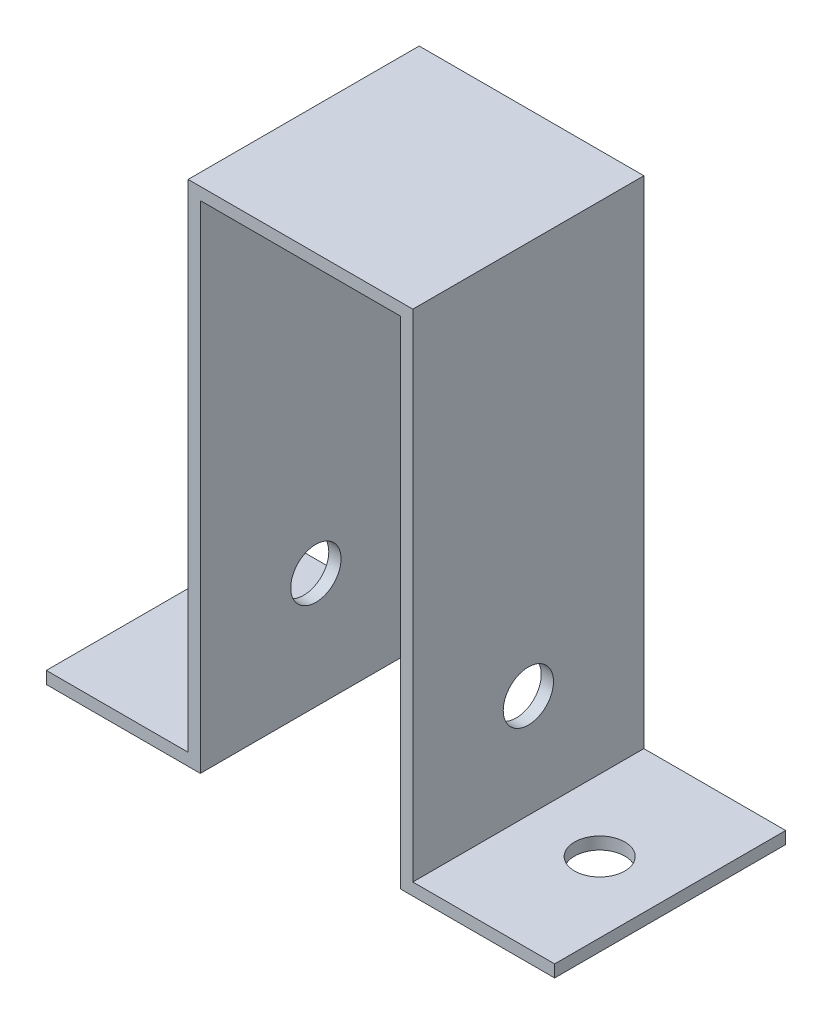
ISO-10303-21;
HEADER;
FILE_DESCRIPTION(('STEP AP214'),'2;1');
FILE_NAME('part.step','',(''),(''),'','','');
FILE_SCHEMA(('AUTOMOTIVE_DESIGN { 1 0 10303 214 1 1 1 1 }'));
ENDSEC;
DATA;
#1=APPLICATION_CONTEXT('core data for automotive mechanical design processes');
#2=APPLICATION_PROTOCOL_DEFINITION('international standard','automotive_design',2000,#1);
#3=PRODUCT_CONTEXT('',#1,'mechanical');
#4=PRODUCT('Part','Part','',(#3));
#5=PRODUCT_RELATED_PRODUCT_CATEGORY('part','',(#4));
#6=PRODUCT_DEFINITION_FORMATION('','',#4);
#7=PRODUCT_DEFINITION_CONTEXT('part definition',#1,'design');
#8=PRODUCT_DEFINITION('design','',#6,#7);
#9=PRODUCT_DEFINITION_SHAPE('','',#8);
#10=(LENGTH_UNIT() NAMED_UNIT(*) SI_UNIT(.MILLI.,.METRE.));
#11=(NAMED_UNIT(*) PLANE_ANGLE_UNIT() SI_UNIT($,.RADIAN.));
#12=(NAMED_UNIT(*) SI_UNIT($,.STERADIAN.) SOLID_ANGLE_UNIT());
#13=UNCERTAINTY_MEASURE_WITH_UNIT(LENGTH_MEASURE(1.E-05),#10,'distance_accuracy_value','');
#14=(GEOMETRIC_REPRESENTATION_CONTEXT(3) GLOBAL_UNCERTAINTY_ASSIGNED_CONTEXT((#13)) GLOBAL_UNIT_ASSIGNED_CONTEXT((#10,
#11,#12)) REPRESENTATION_CONTEXT('',''));
#15=CARTESIAN_POINT('',(0.,0.,0.));
#16=DIRECTION('',(0.,0.,1.));
#17=DIRECTION('',(1.,0.,0.));
#18=AXIS2_PLACEMENT_3D('',#15,#16,#17);
#19=CARTESIAN_POINT('',(0.,33.,7.5));
#20=DIRECTION('',(0.,-1.,0.));
#21=DIRECTION('',(1.,0.,0.));
#22=AXIS2_PLACEMENT_3D('',#19,#20,#21);
#23=PLANE('',#22);
#24=DIRECTION('',(-1.,0.,0.));
#25=VECTOR('',#24,1.);
#26=CARTESIAN_POINT('',(0.,33.,-7.5));
#27=LINE('',#26,#25);
#28=CARTESIAN_POINT('',(7.29375,33.,-7.5));
#29=VERTEX_POINT('',#28);
#30=CARTESIAN_POINT('',(-7.29375,33.,-7.5));
#31=VERTEX_POINT('',#30);
#32=EDGE_CURVE('E126',#29,#31,#27,.T.);
#33=ORIENTED_EDGE('',*,*,#32,.T.);
#34=DIRECTION('',(0.,0.,-1.));
#35=VECTOR('',#34,1.);
#36=CARTESIAN_POINT('',(-7.29375,33.,7.5));
#37=LINE('',#36,#35);
#38=CARTESIAN_POINT('',(-7.29375,33.,7.5));
#39=VERTEX_POINT('',#38);
#40=EDGE_CURVE('E11',#39,#31,#37,.T.);
#41=ORIENTED_EDGE('',*,*,#40,.F.);
#42=DIRECTION('',(-1.,0.,0.));
#43=VECTOR('',#42,1.);
#44=CARTESIAN_POINT('',(0.,33.,7.5));
#45=LINE('',#44,#43);
#46=CARTESIAN_POINT('',(7.29375,33.,7.5));
#47=VERTEX_POINT('',#46);
#48=EDGE_CURVE('E89',#47,#39,#45,.T.);
#49=ORIENTED_EDGE('',*,*,#48,.F.);
#50=DIRECTION('',(0.,0.,-1.));
#51=VECTOR('',#50,1.);
#52=CARTESIAN_POINT('',(7.29375,33.,7.5));
#53=LINE('',#52,#51);
#54=EDGE_CURVE('E191',#47,#29,#53,.T.);
#55=ORIENTED_EDGE('',*,*,#54,.T.);
#56=EDGE_LOOP('',(#33,#41,#49,#55));
#57=FACE_BOUND('',#56,.T.);
#58=ADVANCED_FACE('F35',(#57),#23,.F.);
#59=CARTESIAN_POINT('',(-7.29375,33.,7.5));
#60=DIRECTION('',(1.,0.,0.));
#61=DIRECTION('',(0.,1.,0.));
#62=AXIS2_PLACEMENT_3D('',#59,#60,#61);
#63=PLANE('',#62);
#64=CARTESIAN_POINT('',(-7.29375,7.5,0.));
#65=DIRECTION('',(1.,0.,0.));
#66=DIRECTION('',(0.,1.,0.));
#67=AXIS2_PLACEMENT_3D('',#64,#65,#66);
#68=CIRCLE('',#67,1.63195);
#69=CARTESIAN_POINT('',(-7.29375,9.13195,0.));
#70=VERTEX_POINT('',#69);
#71=EDGE_CURVE('E129',#70,#70,#68,.T.);
#72=ORIENTED_EDGE('',*,*,#71,.T.);
#73=EDGE_LOOP('',(#72));
#74=FACE_BOUND('',#73,.T.);
#75=DIRECTION('',(0.,-1.,0.));
#76=VECTOR('',#75,1.);
#77=CARTESIAN_POINT('',(-7.29375,33.,-7.5));
#78=LINE('',#77,#76);
#79=CARTESIAN_POINT('',(-7.29375,0.79375,-7.5));
#80=VERTEX_POINT('',#79);
#81=EDGE_CURVE('E128',#31,#80,#78,.T.);
#82=ORIENTED_EDGE('',*,*,#81,.T.);
#83=DIRECTION('',(0.,0.,-1.));
#84=VECTOR('',#83,1.);
#85=CARTESIAN_POINT('',(-7.29375,0.79375,7.5));
#86=LINE('',#85,#84);
#87=CARTESIAN_POINT('',(-7.29375,0.79375,7.5));
#88=VERTEX_POINT('',#87);
#89=EDGE_CURVE('E43',#88,#80,#86,.T.);
#90=ORIENTED_EDGE('',*,*,#89,.F.);
#91=DIRECTION('',(0.,-1.,0.));
#92=VECTOR('',#91,1.);
#93=CARTESIAN_POINT('',(-7.29375,33.,7.5));
#94=LINE('',#93,#92);
#95=EDGE_CURVE('E186',#39,#88,#94,.T.);
#96=ORIENTED_EDGE('',*,*,#95,.F.);
#97=ORIENTED_EDGE('',*,*,#40,.T.);
#98=EDGE_LOOP('',(#82,#90,#96,#97));
#99=FACE_BOUND('',#98,.T.);
#100=ADVANCED_FACE('F187',(#74,#99),#63,.F.);
#101=CARTESIAN_POINT('',(-7.29375,0.79375,7.5));
#102=DIRECTION('',(0.,-1.,0.));
#103=DIRECTION('',(1.,0.,0.));
#104=AXIS2_PLACEMENT_3D('',#101,#102,#103);
#105=PLANE('',#104);
#106=CARTESIAN_POINT('',(-11.925,0.793749999999999,0.));
#107=DIRECTION('',(0.,-1.,0.));
#108=DIRECTION('',(1.,0.,0.));
#109=AXIS2_PLACEMENT_3D('',#106,#107,#108);
#110=CIRCLE('',#109,1.63194999999999);
#111=CARTESIAN_POINT('',(-10.29305,0.793749999999999,0.));
#112=VERTEX_POINT('',#111);
#113=EDGE_CURVE('E355',#112,#112,#110,.T.);
#114=ORIENTED_EDGE('',*,*,#113,.T.);
#115=EDGE_LOOP('',(#114));
#116=FACE_BOUND('',#115,.T.);
#117=DIRECTION('',(-1.,0.,0.));
#118=VECTOR('',#117,1.);
#119=CARTESIAN_POINT('',(-7.29375,0.79375,-7.5));
#120=LINE('',#119,#118);
#121=CARTESIAN_POINT('',(-16.5,0.793749999999999,-7.5));
#122=VERTEX_POINT('',#121);
#123=EDGE_CURVE('E131',#80,#122,#120,.T.);
#124=ORIENTED_EDGE('',*,*,#123,.T.);
#125=DIRECTION('',(0.,0.,-1.));
#126=VECTOR('',#125,1.);
#127=CARTESIAN_POINT('',(-16.5,0.793749999999999,7.5));
#128=LINE('',#127,#126);
#129=CARTESIAN_POINT('',(-16.5,0.793749999999999,7.5));
#130=VERTEX_POINT('',#129);
#131=EDGE_CURVE('E115',#130,#122,#128,.T.);
#132=ORIENTED_EDGE('',*,*,#131,.F.);
#133=DIRECTION('',(-1.,0.,0.));
#134=VECTOR('',#133,1.);
#135=CARTESIAN_POINT('',(-7.29375,0.79375,7.5));
#136=LINE('',#135,#134);
#137=EDGE_CURVE('E106',#88,#130,#136,.T.);
#138=ORIENTED_EDGE('',*,*,#137,.F.);
#139=ORIENTED_EDGE('',*,*,#89,.T.);
#140=EDGE_LOOP('',(#124,#132,#138,#139));
#141=FACE_BOUND('',#140,.T.);
#142=ADVANCED_FACE('F145',(#116,#141),#105,.F.);
#143=CARTESIAN_POINT('',(-16.5,0.793749999999999,7.5));
#144=DIRECTION('',(1.,0.,0.));
#145=DIRECTION('',(0.,0.,-1.));
#146=AXIS2_PLACEMENT_3D('',#143,#144,#145);
#147=PLANE('',#146);
#148=DIRECTION('',(0.,-1.,0.));
#149=VECTOR('',#148,1.);
#150=CARTESIAN_POINT('',(-16.5,0.793749999999999,-7.5));
#151=LINE('',#150,#149);
#152=CARTESIAN_POINT('',(-16.5,0.,-7.5));
#153=VERTEX_POINT('',#152);
#154=EDGE_CURVE('E114',#122,#153,#151,.T.);
#155=ORIENTED_EDGE('',*,*,#154,.T.);
#156=DIRECTION('',(0.,0.,-1.));
#157=VECTOR('',#156,1.);
#158=CARTESIAN_POINT('',(-16.5,0.,7.5));
#159=LINE('',#158,#157);
#160=CARTESIAN_POINT('',(-16.5,0.,7.5));
#161=VERTEX_POINT('',#160);
#162=EDGE_CURVE('E111',#161,#153,#159,.T.);
#163=ORIENTED_EDGE('',*,*,#162,.F.);
#164=DIRECTION('',(0.,-1.,0.));
#165=VECTOR('',#164,1.);
#166=CARTESIAN_POINT('',(-16.5,0.793749999999999,7.5));
#167=LINE('',#166,#165);
#168=EDGE_CURVE('E100',#130,#161,#167,.T.);
#169=ORIENTED_EDGE('',*,*,#168,.F.);
#170=ORIENTED_EDGE('',*,*,#131,.T.);
#171=EDGE_LOOP('',(#155,#163,#169,#170));
#172=FACE_BOUND('',#171,.T.);
#173=ADVANCED_FACE('F112',(#172),#147,.F.);
#174=CARTESIAN_POINT('',(-6.5,0.,7.5));
#175=DIRECTION('',(0.,1.,0.));
#176=DIRECTION('',(-1.,0.,0.));
#177=AXIS2_PLACEMENT_3D('',#174,#175,#176);
#178=PLANE('',#177);
#179=CARTESIAN_POINT('',(-11.925,0.,0.));
#180=DIRECTION('',(0.,-1.,0.));
#181=DIRECTION('',(0.,0.,-1.));
#182=AXIS2_PLACEMENT_3D('',#179,#180,#181);
#183=CIRCLE('',#182,1.63194999999999);
#184=CARTESIAN_POINT('',(-11.925,0.,-1.63194999999999));
#185=VERTEX_POINT('',#184);
#186=EDGE_CURVE('E352',#185,#185,#183,.T.);
#187=ORIENTED_EDGE('',*,*,#186,.F.);
#188=EDGE_LOOP('',(#187));
#189=FACE_BOUND('',#188,.T.);
#190=DIRECTION('',(1.,0.,0.));
#191=VECTOR('',#190,1.);
#192=CARTESIAN_POINT('',(-6.5,0.,-7.5));
#193=LINE('',#192,#191);
#194=CARTESIAN_POINT('',(-6.5,0.,-7.5));
#195=VERTEX_POINT('',#194);
#196=EDGE_CURVE('E75',#153,#195,#193,.T.);
#197=ORIENTED_EDGE('',*,*,#196,.T.);
#198=DIRECTION('',(0.,0.,-1.));
#199=VECTOR('',#198,1.);
#200=CARTESIAN_POINT('',(-6.5,0.,7.5));
#201=LINE('',#200,#199);
#202=CARTESIAN_POINT('',(-6.5,0.,7.5));
#203=VERTEX_POINT('',#202);
#204=EDGE_CURVE('E116',#203,#195,#201,.T.);
#205=ORIENTED_EDGE('',*,*,#204,.F.);
#206=DIRECTION('',(1.,0.,0.));
#207=VECTOR('',#206,1.);
#208=CARTESIAN_POINT('',(-6.5,0.,7.5));
#209=LINE('',#208,#207);
#210=EDGE_CURVE('E104',#161,#203,#209,.T.);
#211=ORIENTED_EDGE('',*,*,#210,.F.);
#212=ORIENTED_EDGE('',*,*,#162,.T.);
#213=EDGE_LOOP('',(#197,#205,#211,#212));
#214=FACE_BOUND('',#213,.T.);
#215=ADVANCED_FACE('F118',(#189,#214),#178,.F.);
#216=CARTESIAN_POINT('',(-6.5,32.20625,7.5));
#217=DIRECTION('',(-1.,0.,0.));
#218=DIRECTION('',(0.,-1.,0.));
#219=AXIS2_PLACEMENT_3D('',#216,#217,#218);
#220=PLANE('',#219);
#221=CARTESIAN_POINT('',(-6.5,7.5,0.));
#222=DIRECTION('',(1.,0.,0.));
#223=DIRECTION('',(0.,0.,-1.));
#224=AXIS2_PLACEMENT_3D('',#221,#222,#223);
#225=CIRCLE('',#224,1.63195);
#226=CARTESIAN_POINT('',(-6.5,7.5,-1.63195));
#227=VERTEX_POINT('',#226);
#228=EDGE_CURVE('E173',#227,#227,#225,.T.);
#229=ORIENTED_EDGE('',*,*,#228,.F.);
#230=EDGE_LOOP('',(#229));
#231=FACE_BOUND('',#230,.T.);
#232=DIRECTION('',(0.,1.,0.));
#233=VECTOR('',#232,1.);
#234=CARTESIAN_POINT('',(-6.5,32.20625,-7.5));
#235=LINE('',#234,#233);
#236=CARTESIAN_POINT('',(-6.5,32.20625,-7.5));
#237=VERTEX_POINT('',#236);
#238=EDGE_CURVE('E81',#195,#237,#235,.T.);
#239=ORIENTED_EDGE('',*,*,#238,.T.);
#240=DIRECTION('',(0.,0.,-1.));
#241=VECTOR('',#240,1.);
#242=CARTESIAN_POINT('',(-6.5,32.20625,7.5));
#243=LINE('',#242,#241);
#244=CARTESIAN_POINT('',(-6.5,32.20625,7.5));
#245=VERTEX_POINT('',#244);
#246=EDGE_CURVE('E125',#245,#237,#243,.T.);
#247=ORIENTED_EDGE('',*,*,#246,.F.);
#248=DIRECTION('',(0.,1.,0.));
#249=VECTOR('',#248,1.);
#250=CARTESIAN_POINT('',(-6.5,32.20625,7.5));
#251=LINE('',#250,#249);
#252=EDGE_CURVE('E51',#203,#245,#251,.T.);
#253=ORIENTED_EDGE('',*,*,#252,.F.);
#254=ORIENTED_EDGE('',*,*,#204,.T.);
#255=EDGE_LOOP('',(#239,#247,#253,#254));
#256=FACE_BOUND('',#255,.T.);
#257=ADVANCED_FACE('F290',(#231,#256),#220,.F.);
#258=CARTESIAN_POINT('',(0.,32.20625,7.5));
#259=DIRECTION('',(0.,1.,0.));
#260=DIRECTION('',(0.,0.,1.));
#261=AXIS2_PLACEMENT_3D('',#258,#259,#260);
#262=PLANE('',#261);
#263=DIRECTION('',(1.,0.,0.));
#264=VECTOR('',#263,1.);
#265=CARTESIAN_POINT('',(0.,32.20625,-7.5));
#266=LINE('',#265,#264);
#267=CARTESIAN_POINT('',(6.5,32.20625,-7.5));
#268=VERTEX_POINT('',#267);
#269=EDGE_CURVE('E136',#237,#268,#266,.T.);
#270=ORIENTED_EDGE('',*,*,#269,.T.);
#271=DIRECTION('',(0.,0.,-1.));
#272=VECTOR('',#271,1.);
#273=CARTESIAN_POINT('',(6.5,32.20625,7.5));
#274=LINE('',#273,#272);
#275=CARTESIAN_POINT('',(6.5,32.20625,7.5));
#276=VERTEX_POINT('',#275);
#277=EDGE_CURVE('E164',#276,#268,#274,.T.);
#278=ORIENTED_EDGE('',*,*,#277,.F.);
#279=DIRECTION('',(1.,0.,0.));
#280=VECTOR('',#279,1.);
#281=CARTESIAN_POINT('',(0.,32.20625,7.5));
#282=LINE('',#281,#280);
#283=EDGE_CURVE('E120',#245,#276,#282,.T.);
#284=ORIENTED_EDGE('',*,*,#283,.F.);
#285=ORIENTED_EDGE('',*,*,#246,.T.);
#286=EDGE_LOOP('',(#270,#278,#284,#285));
#287=FACE_BOUND('',#286,.T.);
#288=ADVANCED_FACE('F161',(#287),#262,.F.);
#289=CARTESIAN_POINT('',(0.,0.,7.5));
#290=DIRECTION('',(0.,0.,-1.));
#291=DIRECTION('',(-1.,0.,0.));
#292=AXIS2_PLACEMENT_3D('',#289,#290,#291);
#293=PLANE('',#292);
#294=ORIENTED_EDGE('',*,*,#283,.T.);
#295=DIRECTION('',(0.,1.,0.));
#296=VECTOR('',#295,1.);
#297=CARTESIAN_POINT('',(6.5,32.20625,7.5));
#298=LINE('',#297,#296);
#299=CARTESIAN_POINT('',(6.5,0.,7.5));
#300=VERTEX_POINT('',#299);
#301=EDGE_CURVE('E172',#300,#276,#298,.T.);
#302=ORIENTED_EDGE('',*,*,#301,.F.);
#303=DIRECTION('',(-1.,0.,0.));
#304=VECTOR('',#303,1.);
#305=CARTESIAN_POINT('',(6.5,0.,7.5));
#306=LINE('',#305,#304);
#307=CARTESIAN_POINT('',(16.5,0.,7.5));
#308=VERTEX_POINT('',#307);
#309=EDGE_CURVE('E227',#308,#300,#306,.T.);
#310=ORIENTED_EDGE('',*,*,#309,.F.);
#311=DIRECTION('',(0.,-1.,0.));
#312=VECTOR('',#311,1.);
#313=CARTESIAN_POINT('',(16.5,0.793749999999999,7.5));
#314=LINE('',#313,#312);
#315=CARTESIAN_POINT('',(16.5,0.793749999999999,7.5));
#316=VERTEX_POINT('',#315);
#317=EDGE_CURVE('E231',#316,#308,#314,.T.);
#318=ORIENTED_EDGE('',*,*,#317,.F.);
#319=DIRECTION('',(1.,0.,0.));
#320=VECTOR('',#319,1.);
#321=CARTESIAN_POINT('',(7.29375,0.79375,7.5));
#322=LINE('',#321,#320);
#323=CARTESIAN_POINT('',(7.29375,0.79375,7.5));
#324=VERTEX_POINT('',#323);
#325=EDGE_CURVE('E233',#324,#316,#322,.T.);
#326=ORIENTED_EDGE('',*,*,#325,.F.);
#327=DIRECTION('',(0.,-1.,0.));
#328=VECTOR('',#327,1.);
#329=CARTESIAN_POINT('',(7.29375,33.,7.5));
#330=LINE('',#329,#328);
#331=EDGE_CURVE('E239',#47,#324,#330,.T.);
#332=ORIENTED_EDGE('',*,*,#331,.F.);
#333=ORIENTED_EDGE('',*,*,#48,.T.);
#334=ORIENTED_EDGE('',*,*,#95,.T.);
#335=ORIENTED_EDGE('',*,*,#137,.T.);
#336=ORIENTED_EDGE('',*,*,#168,.T.);
#337=ORIENTED_EDGE('',*,*,#210,.T.);
#338=ORIENTED_EDGE('',*,*,#252,.T.);
#339=EDGE_LOOP('',(#294,#302,#310,#318,#326,#332,#333,#334,#335,#336,#337,#338));
#340=FACE_BOUND('',#339,.T.);
#341=ADVANCED_FACE('F102',(#340),#293,.F.);
#342=CARTESIAN_POINT('',(0.,0.,-7.5));
#343=DIRECTION('',(0.,0.,-1.));
#344=DIRECTION('',(-1.,0.,0.));
#345=AXIS2_PLACEMENT_3D('',#342,#343,#344);
#346=PLANE('',#345);
#347=ORIENTED_EDGE('',*,*,#32,.F.);
#348=DIRECTION('',(0.,-1.,0.));
#349=VECTOR('',#348,1.);
#350=CARTESIAN_POINT('',(7.29375,33.,-7.5));
#351=LINE('',#350,#349);
#352=CARTESIAN_POINT('',(7.29375,0.79375,-7.5));
#353=VERTEX_POINT('',#352);
#354=EDGE_CURVE('E196',#29,#353,#351,.T.);
#355=ORIENTED_EDGE('',*,*,#354,.T.);
#356=DIRECTION('',(1.,0.,0.));
#357=VECTOR('',#356,1.);
#358=CARTESIAN_POINT('',(7.29375,0.79375,-7.5));
#359=LINE('',#358,#357);
#360=CARTESIAN_POINT('',(16.5,0.793749999999999,-7.5));
#361=VERTEX_POINT('',#360);
#362=EDGE_CURVE('E248',#353,#361,#359,.T.);
#363=ORIENTED_EDGE('',*,*,#362,.T.);
#364=DIRECTION('',(0.,-1.,0.));
#365=VECTOR('',#364,1.);
#366=CARTESIAN_POINT('',(16.5,0.793749999999999,-7.5));
#367=LINE('',#366,#365);
#368=CARTESIAN_POINT('',(16.5,0.,-7.5));
#369=VERTEX_POINT('',#368);
#370=EDGE_CURVE('E245',#361,#369,#367,.T.);
#371=ORIENTED_EDGE('',*,*,#370,.T.);
#372=DIRECTION('',(-1.,0.,0.));
#373=VECTOR('',#372,1.);
#374=CARTESIAN_POINT('',(6.5,0.,-7.5));
#375=LINE('',#374,#373);
#376=CARTESIAN_POINT('',(6.5,0.,-7.5));
#377=VERTEX_POINT('',#376);
#378=EDGE_CURVE('E242',#369,#377,#375,.T.);
#379=ORIENTED_EDGE('',*,*,#378,.T.);
#380=DIRECTION('',(0.,1.,0.));
#381=VECTOR('',#380,1.);
#382=CARTESIAN_POINT('',(6.5,32.20625,-7.5));
#383=LINE('',#382,#381);
#384=EDGE_CURVE('E157',#377,#268,#383,.T.);
#385=ORIENTED_EDGE('',*,*,#384,.T.);
#386=ORIENTED_EDGE('',*,*,#269,.F.);
#387=ORIENTED_EDGE('',*,*,#238,.F.);
#388=ORIENTED_EDGE('',*,*,#196,.F.);
#389=ORIENTED_EDGE('',*,*,#154,.F.);
#390=ORIENTED_EDGE('',*,*,#123,.F.);
#391=ORIENTED_EDGE('',*,*,#81,.F.);
#392=EDGE_LOOP('',(#347,#355,#363,#371,#379,#385,#386,#387,#388,#389,#390,#391));
#393=FACE_BOUND('',#392,.T.);
#394=ADVANCED_FACE('F151',(#393),#346,.T.);
#395=CARTESIAN_POINT('',(-6.5,7.5,0.));
#396=DIRECTION('',(1.,0.,0.));
#397=DIRECTION('',(0.,0.,-1.));
#398=AXIS2_PLACEMENT_3D('',#395,#396,#397);
#399=CYLINDRICAL_SURFACE('',#398,1.63195);
#400=ORIENTED_EDGE('',*,*,#228,.T.);
#401=EDGE_LOOP('',(#400));
#402=FACE_BOUND('',#401,.T.);
#403=ORIENTED_EDGE('',*,*,#71,.F.);
#404=EDGE_LOOP('',(#403));
#405=FACE_BOUND('',#404,.T.);
#406=ADVANCED_FACE('F299',(#402,#405),#399,.F.);
#407=CARTESIAN_POINT('',(6.5,32.20625,7.5));
#408=DIRECTION('',(-1.,0.,0.));
#409=DIRECTION('',(0.,-1.,0.));
#410=AXIS2_PLACEMENT_3D('',#407,#408,#409);
#411=PLANE('',#410);
#412=CARTESIAN_POINT('',(6.5,7.5,0.));
#413=DIRECTION('',(-1.,0.,0.));
#414=DIRECTION('',(0.,0.,1.));
#415=AXIS2_PLACEMENT_3D('',#412,#413,#414);
#416=CIRCLE('',#415,1.63195);
#417=CARTESIAN_POINT('',(6.5,7.5,1.63195));
#418=VERTEX_POINT('',#417);
#419=EDGE_CURVE('E365',#418,#418,#416,.T.);
#420=ORIENTED_EDGE('',*,*,#419,.F.);
#421=EDGE_LOOP('',(#420));
#422=FACE_BOUND('',#421,.T.);
#423=ORIENTED_EDGE('',*,*,#384,.F.);
#424=DIRECTION('',(0.,0.,-1.));
#425=VECTOR('',#424,1.);
#426=CARTESIAN_POINT('',(6.5,0.,7.5));
#427=LINE('',#426,#425);
#428=EDGE_CURVE('E174',#300,#377,#427,.T.);
#429=ORIENTED_EDGE('',*,*,#428,.F.);
#430=ORIENTED_EDGE('',*,*,#301,.T.);
#431=ORIENTED_EDGE('',*,*,#277,.T.);
#432=EDGE_LOOP('',(#423,#429,#430,#431));
#433=FACE_BOUND('',#432,.T.);
#434=ADVANCED_FACE('F169',(#422,#433),#411,.T.);
#435=CARTESIAN_POINT('',(6.5,0.,7.5));
#436=DIRECTION('',(0.,-1.,0.));
#437=DIRECTION('',(1.,0.,0.));
#438=AXIS2_PLACEMENT_3D('',#435,#436,#437);
#439=PLANE('',#438);
#440=CARTESIAN_POINT('',(11.925,0.,0.));
#441=DIRECTION('',(0.,-1.,0.));
#442=DIRECTION('',(0.,0.,-1.));
#443=AXIS2_PLACEMENT_3D('',#440,#441,#442);
#444=CIRCLE('',#443,1.63194999999999);
#445=CARTESIAN_POINT('',(11.925,0.,-1.63194999999999));
#446=VERTEX_POINT('',#445);
#447=EDGE_CURVE('E356',#446,#446,#444,.T.);
#448=ORIENTED_EDGE('',*,*,#447,.F.);
#449=EDGE_LOOP('',(#448));
#450=FACE_BOUND('',#449,.T.);
#451=ORIENTED_EDGE('',*,*,#378,.F.);
#452=DIRECTION('',(0.,0.,-1.));
#453=VECTOR('',#452,1.);
#454=CARTESIAN_POINT('',(16.5,0.,7.5));
#455=LINE('',#454,#453);
#456=EDGE_CURVE('E179',#308,#369,#455,.T.);
#457=ORIENTED_EDGE('',*,*,#456,.F.);
#458=ORIENTED_EDGE('',*,*,#309,.T.);
#459=ORIENTED_EDGE('',*,*,#428,.T.);
#460=EDGE_LOOP('',(#451,#457,#458,#459));
#461=FACE_BOUND('',#460,.T.);
#462=ADVANCED_FACE('F230',(#450,#461),#439,.T.);
#463=CARTESIAN_POINT('',(16.5,0.793749999999999,7.5));
#464=DIRECTION('',(1.,0.,0.));
#465=DIRECTION('',(0.,0.,-1.));
#466=AXIS2_PLACEMENT_3D('',#463,#464,#465);
#467=PLANE('',#466);
#468=ORIENTED_EDGE('',*,*,#370,.F.);
#469=DIRECTION('',(0.,0.,-1.));
#470=VECTOR('',#469,1.);
#471=CARTESIAN_POINT('',(16.5,0.793749999999999,7.5));
#472=LINE('',#471,#470);
#473=EDGE_CURVE('E253',#316,#361,#472,.T.);
#474=ORIENTED_EDGE('',*,*,#473,.F.);
#475=ORIENTED_EDGE('',*,*,#317,.T.);
#476=ORIENTED_EDGE('',*,*,#456,.T.);
#477=EDGE_LOOP('',(#468,#474,#475,#476));
#478=FACE_BOUND('',#477,.T.);
#479=ADVANCED_FACE('F256',(#478),#467,.T.);
#480=CARTESIAN_POINT('',(7.29375,0.79375,7.5));
#481=DIRECTION('',(0.,1.,0.));
#482=DIRECTION('',(-1.,0.,0.));
#483=AXIS2_PLACEMENT_3D('',#480,#481,#482);
#484=PLANE('',#483);
#485=CARTESIAN_POINT('',(11.925,0.793749999999999,0.));
#486=DIRECTION('',(0.,1.,0.));
#487=DIRECTION('',(-1.,0.,0.));
#488=AXIS2_PLACEMENT_3D('',#485,#486,#487);
#489=CIRCLE('',#488,1.63194999999999);
#490=CARTESIAN_POINT('',(10.29305,0.793749999999999,0.));
#491=VERTEX_POINT('',#490);
#492=EDGE_CURVE('E359',#491,#491,#489,.T.);
#493=ORIENTED_EDGE('',*,*,#492,.F.);
#494=EDGE_LOOP('',(#493));
#495=FACE_BOUND('',#494,.T.);
#496=ORIENTED_EDGE('',*,*,#362,.F.);
#497=DIRECTION('',(0.,0.,-1.));
#498=VECTOR('',#497,1.);
#499=CARTESIAN_POINT('',(7.29375,0.79375,7.5));
#500=LINE('',#499,#498);
#501=EDGE_CURVE('E204',#324,#353,#500,.T.);
#502=ORIENTED_EDGE('',*,*,#501,.F.);
#503=ORIENTED_EDGE('',*,*,#325,.T.);
#504=ORIENTED_EDGE('',*,*,#473,.T.);
#505=EDGE_LOOP('',(#496,#502,#503,#504));
#506=FACE_BOUND('',#505,.T.);
#507=ADVANCED_FACE('F258',(#495,#506),#484,.T.);
#508=CARTESIAN_POINT('',(7.29375,33.,7.5));
#509=DIRECTION('',(1.,0.,0.));
#510=DIRECTION('',(0.,1.,0.));
#511=AXIS2_PLACEMENT_3D('',#508,#509,#510);
#512=PLANE('',#511);
#513=CARTESIAN_POINT('',(7.29375,7.5,0.));
#514=DIRECTION('',(1.,0.,0.));
#515=DIRECTION('',(0.,1.,0.));
#516=AXIS2_PLACEMENT_3D('',#513,#514,#515);
#517=CIRCLE('',#516,1.63195);
#518=CARTESIAN_POINT('',(7.29375,9.13195,0.));
#519=VERTEX_POINT('',#518);
#520=EDGE_CURVE('E243',#519,#519,#517,.T.);
#521=ORIENTED_EDGE('',*,*,#520,.F.);
#522=EDGE_LOOP('',(#521));
#523=FACE_BOUND('',#522,.T.);
#524=ORIENTED_EDGE('',*,*,#354,.F.);
#525=ORIENTED_EDGE('',*,*,#54,.F.);
#526=ORIENTED_EDGE('',*,*,#331,.T.);
#527=ORIENTED_EDGE('',*,*,#501,.T.);
#528=EDGE_LOOP('',(#524,#525,#526,#527));
#529=FACE_BOUND('',#528,.T.);
#530=ADVANCED_FACE('F260',(#523,#529),#512,.T.);
#531=CARTESIAN_POINT('',(6.5,7.5,0.));
#532=DIRECTION('',(-1.,0.,0.));
#533=DIRECTION('',(0.,0.,1.));
#534=AXIS2_PLACEMENT_3D('',#531,#532,#533);
#535=CYLINDRICAL_SURFACE('',#534,1.63195);
#536=ORIENTED_EDGE('',*,*,#520,.T.);
#537=EDGE_LOOP('',(#536));
#538=FACE_BOUND('',#537,.T.);
#539=ORIENTED_EDGE('',*,*,#419,.T.);
#540=EDGE_LOOP('',(#539));
#541=FACE_BOUND('',#540,.T.);
#542=ADVANCED_FACE('F262',(#538,#541),#535,.F.);
#543=CARTESIAN_POINT('',(11.925,0.,0.));
#544=DIRECTION('',(0.,-1.,0.));
#545=DIRECTION('',(0.,0.,-1.));
#546=AXIS2_PLACEMENT_3D('',#543,#544,#545);
#547=CYLINDRICAL_SURFACE('',#546,1.63194999999999);
#548=ORIENTED_EDGE('',*,*,#492,.T.);
#549=EDGE_LOOP('',(#548));
#550=FACE_BOUND('',#549,.T.);
#551=ORIENTED_EDGE('',*,*,#447,.T.);
#552=EDGE_LOOP('',(#551));
#553=FACE_BOUND('',#552,.T.);
#554=ADVANCED_FACE('F269',(#550,#553),#547,.F.);
#555=CARTESIAN_POINT('',(-11.925,0.,0.));
#556=DIRECTION('',(0.,-1.,0.));
#557=DIRECTION('',(0.,0.,-1.));
#558=AXIS2_PLACEMENT_3D('',#555,#556,#557);
#559=CYLINDRICAL_SURFACE('',#558,1.63194999999999);
#560=ORIENTED_EDGE('',*,*,#186,.T.);
#561=EDGE_LOOP('',(#560));
#562=FACE_BOUND('',#561,.T.);
#563=ORIENTED_EDGE('',*,*,#113,.F.);
#564=EDGE_LOOP('',(#563));
#565=FACE_BOUND('',#564,.T.);
#566=ADVANCED_FACE('F334',(#562,#565),#559,.F.);
#567=CLOSED_SHELL('',(#58,#100,#142,#173,#215,#257,#288,#341,#394,#406,#434,#462,#479,#507,#530,
#542,#554,#566));
#568=MANIFOLD_SOLID_BREP('B2',#567);
#569=ADVANCED_BREP_SHAPE_REPRESENTATION('',(#18,#568),#14);
#570=SHAPE_DEFINITION_REPRESENTATION(#9,#569);
ENDSEC;
END-ISO-10303-21;
